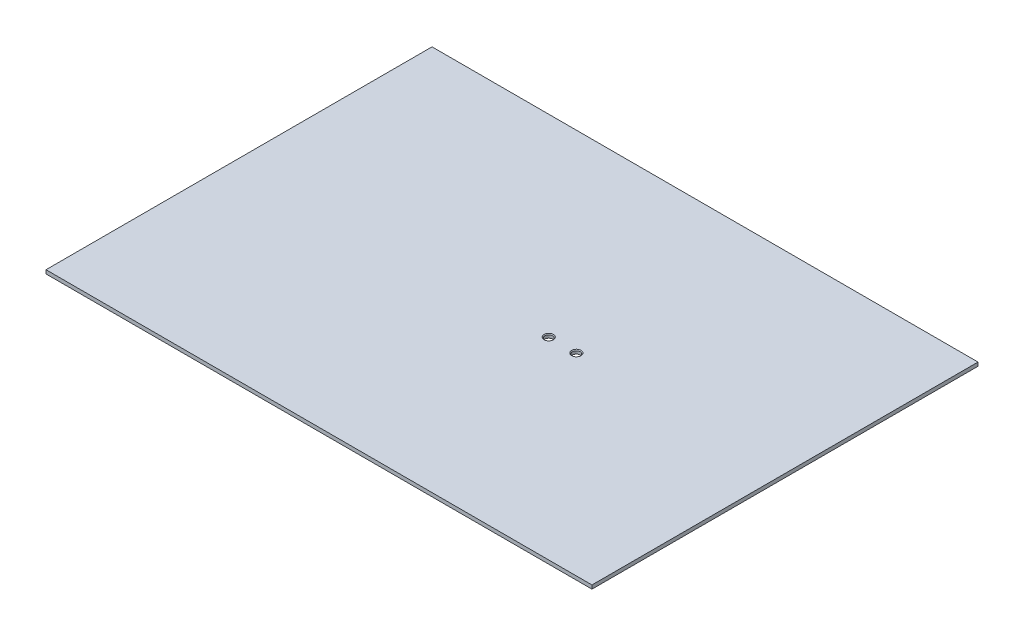
ISO-10303-21;
HEADER;
FILE_DESCRIPTION(('STEP AP214'),'2;1');
FILE_NAME('part.step','',(''),(''),'','','');
FILE_SCHEMA(('AUTOMOTIVE_DESIGN { 1 0 10303 214 1 1 1 1 }'));
ENDSEC;
DATA;
#1=APPLICATION_CONTEXT('core data for automotive mechanical design processes');
#2=APPLICATION_PROTOCOL_DEFINITION('international standard','automotive_design',2000,#1);
#3=PRODUCT_CONTEXT('',#1,'mechanical');
#4=PRODUCT('Part','Part','',(#3));
#5=PRODUCT_RELATED_PRODUCT_CATEGORY('part','',(#4));
#6=PRODUCT_DEFINITION_FORMATION('','',#4);
#7=PRODUCT_DEFINITION_CONTEXT('part definition',#1,'design');
#8=PRODUCT_DEFINITION('design','',#6,#7);
#9=PRODUCT_DEFINITION_SHAPE('','',#8);
#10=(LENGTH_UNIT() NAMED_UNIT(*) SI_UNIT(.MILLI.,.METRE.));
#11=(NAMED_UNIT(*) PLANE_ANGLE_UNIT() SI_UNIT($,.RADIAN.));
#12=(NAMED_UNIT(*) SI_UNIT($,.STERADIAN.) SOLID_ANGLE_UNIT());
#13=UNCERTAINTY_MEASURE_WITH_UNIT(LENGTH_MEASURE(1.E-05),#10,'distance_accuracy_value','');
#14=(GEOMETRIC_REPRESENTATION_CONTEXT(3) GLOBAL_UNCERTAINTY_ASSIGNED_CONTEXT((#13)) GLOBAL_UNIT_ASSIGNED_CONTEXT((#10,
#11,#12)) REPRESENTATION_CONTEXT('',''));
#15=CARTESIAN_POINT('',(0.,0.,0.));
#16=DIRECTION('',(0.,0.,1.));
#17=DIRECTION('',(1.,0.,0.));
#18=AXIS2_PLACEMENT_3D('',#15,#16,#17);
#19=CARTESIAN_POINT('',(-148.5,2.,105.));
#20=DIRECTION('',(-1.,0.,0.));
#21=DIRECTION('',(0.,0.,1.));
#22=AXIS2_PLACEMENT_3D('',#19,#20,#21);
#23=PLANE('',#22);
#24=DIRECTION('',(0.,0.,-1.));
#25=VECTOR('',#24,1.);
#26=CARTESIAN_POINT('',(-148.5,0.,105.));
#27=LINE('',#26,#25);
#28=CARTESIAN_POINT('',(-148.5,0.,105.));
#29=VERTEX_POINT('',#28);
#30=CARTESIAN_POINT('',(-148.5,0.,-105.));
#31=VERTEX_POINT('',#30);
#32=EDGE_CURVE('E117',#29,#31,#27,.T.);
#33=ORIENTED_EDGE('',*,*,#32,.F.);
#34=DIRECTION('',(0.,-1.,0.));
#35=VECTOR('',#34,1.);
#36=CARTESIAN_POINT('',(-148.5,2.,105.));
#37=LINE('',#36,#35);
#38=CARTESIAN_POINT('',(-148.5,2.,105.));
#39=VERTEX_POINT('',#38);
#40=EDGE_CURVE('E11',#39,#29,#37,.T.);
#41=ORIENTED_EDGE('',*,*,#40,.F.);
#42=DIRECTION('',(0.,0.,-1.));
#43=VECTOR('',#42,1.);
#44=CARTESIAN_POINT('',(-148.5,2.,105.));
#45=LINE('',#44,#43);
#46=CARTESIAN_POINT('',(-148.5,2.,-105.));
#47=VERTEX_POINT('',#46);
#48=EDGE_CURVE('E111',#39,#47,#45,.T.);
#49=ORIENTED_EDGE('',*,*,#48,.T.);
#50=DIRECTION('',(0.,-1.,0.));
#51=VECTOR('',#50,1.);
#52=CARTESIAN_POINT('',(-148.5,2.,-105.));
#53=LINE('',#52,#51);
#54=EDGE_CURVE('E54',#47,#31,#53,.T.);
#55=ORIENTED_EDGE('',*,*,#54,.T.);
#56=EDGE_LOOP('',(#33,#41,#49,#55));
#57=FACE_BOUND('',#56,.T.);
#58=ADVANCED_FACE('F51',(#57),#23,.T.);
#59=CARTESIAN_POINT('',(-148.5,2.,105.));
#60=DIRECTION('',(0.,0.,-1.));
#61=DIRECTION('',(-1.,0.,0.));
#62=AXIS2_PLACEMENT_3D('',#59,#60,#61);
#63=PLANE('',#62);
#64=DIRECTION('',(1.,0.,0.));
#65=VECTOR('',#64,1.);
#66=CARTESIAN_POINT('',(-148.5,0.,105.));
#67=LINE('',#66,#65);
#68=CARTESIAN_POINT('',(148.5,0.,105.));
#69=VERTEX_POINT('',#68);
#70=EDGE_CURVE('E84',#29,#69,#67,.T.);
#71=ORIENTED_EDGE('',*,*,#70,.T.);
#72=DIRECTION('',(0.,-1.,0.));
#73=VECTOR('',#72,1.);
#74=CARTESIAN_POINT('',(148.5,2.,105.));
#75=LINE('',#74,#73);
#76=CARTESIAN_POINT('',(148.5,2.,105.));
#77=VERTEX_POINT('',#76);
#78=EDGE_CURVE('E60',#77,#69,#75,.T.);
#79=ORIENTED_EDGE('',*,*,#78,.F.);
#80=DIRECTION('',(1.,0.,0.));
#81=VECTOR('',#80,1.);
#82=CARTESIAN_POINT('',(-148.5,2.,105.));
#83=LINE('',#82,#81);
#84=EDGE_CURVE('E101',#39,#77,#83,.T.);
#85=ORIENTED_EDGE('',*,*,#84,.F.);
#86=ORIENTED_EDGE('',*,*,#40,.T.);
#87=EDGE_LOOP('',(#71,#79,#85,#86));
#88=FACE_BOUND('',#87,.T.);
#89=ADVANCED_FACE('F128',(#88),#63,.F.);
#90=CARTESIAN_POINT('',(148.5,2.,105.));
#91=DIRECTION('',(-1.,0.,0.));
#92=DIRECTION('',(0.,0.,1.));
#93=AXIS2_PLACEMENT_3D('',#90,#91,#92);
#94=PLANE('',#93);
#95=DIRECTION('',(0.,0.,-1.));
#96=VECTOR('',#95,1.);
#97=CARTESIAN_POINT('',(148.5,0.,105.));
#98=LINE('',#97,#96);
#99=CARTESIAN_POINT('',(148.5,0.,-105.));
#100=VERTEX_POINT('',#99);
#101=EDGE_CURVE('E108',#69,#100,#98,.T.);
#102=ORIENTED_EDGE('',*,*,#101,.T.);
#103=DIRECTION('',(0.,-1.,0.));
#104=VECTOR('',#103,1.);
#105=CARTESIAN_POINT('',(148.5,2.,-105.));
#106=LINE('',#105,#104);
#107=CARTESIAN_POINT('',(148.5,2.,-105.));
#108=VERTEX_POINT('',#107);
#109=EDGE_CURVE('E105',#108,#100,#106,.T.);
#110=ORIENTED_EDGE('',*,*,#109,.F.);
#111=DIRECTION('',(0.,0.,-1.));
#112=VECTOR('',#111,1.);
#113=CARTESIAN_POINT('',(148.5,2.,105.));
#114=LINE('',#113,#112);
#115=EDGE_CURVE('E96',#77,#108,#114,.T.);
#116=ORIENTED_EDGE('',*,*,#115,.F.);
#117=ORIENTED_EDGE('',*,*,#78,.T.);
#118=EDGE_LOOP('',(#102,#110,#116,#117));
#119=FACE_BOUND('',#118,.T.);
#120=ADVANCED_FACE('F106',(#119),#94,.F.);
#121=CARTESIAN_POINT('',(-148.5,2.,-105.));
#122=DIRECTION('',(0.,0.,-1.));
#123=DIRECTION('',(-1.,0.,0.));
#124=AXIS2_PLACEMENT_3D('',#121,#122,#123);
#125=PLANE('',#124);
#126=DIRECTION('',(1.,0.,0.));
#127=VECTOR('',#126,1.);
#128=CARTESIAN_POINT('',(-148.5,0.,-105.));
#129=LINE('',#128,#127);
#130=EDGE_CURVE('E120',#31,#100,#129,.T.);
#131=ORIENTED_EDGE('',*,*,#130,.F.);
#132=ORIENTED_EDGE('',*,*,#54,.F.);
#133=DIRECTION('',(1.,0.,0.));
#134=VECTOR('',#133,1.);
#135=CARTESIAN_POINT('',(-148.5,2.,-105.));
#136=LINE('',#135,#134);
#137=EDGE_CURVE('E100',#47,#108,#136,.T.);
#138=ORIENTED_EDGE('',*,*,#137,.T.);
#139=ORIENTED_EDGE('',*,*,#109,.T.);
#140=EDGE_LOOP('',(#131,#132,#138,#139));
#141=FACE_BOUND('',#140,.T.);
#142=ADVANCED_FACE('F110',(#141),#125,.T.);
#143=CARTESIAN_POINT('',(0.,2.,0.));
#144=DIRECTION('',(0.,-1.,0.));
#145=DIRECTION('',(0.,0.,-1.));
#146=AXIS2_PLACEMENT_3D('',#143,#144,#145);
#147=PLANE('',#146);
#148=CARTESIAN_POINT('',(35.,2.,0.));
#149=DIRECTION('',(0.,1.,0.));
#150=DIRECTION('',(0.,0.,1.));
#151=AXIS2_PLACEMENT_3D('',#148,#149,#150);
#152=CIRCLE('',#151,2.525);
#153=CARTESIAN_POINT('',(35.,2.,2.525));
#154=VERTEX_POINT('',#153);
#155=EDGE_CURVE('E174',#154,#154,#152,.T.);
#156=ORIENTED_EDGE('',*,*,#155,.F.);
#157=EDGE_LOOP('',(#156));
#158=FACE_BOUND('',#157,.T.);
#159=CARTESIAN_POINT('',(20.,2.,0.));
#160=DIRECTION('',(0.,1.,0.));
#161=DIRECTION('',(0.,0.,1.));
#162=AXIS2_PLACEMENT_3D('',#159,#160,#161);
#163=CIRCLE('',#162,2.525);
#164=CARTESIAN_POINT('',(20.,2.,2.525));
#165=VERTEX_POINT('',#164);
#166=EDGE_CURVE('E181',#165,#165,#163,.T.);
#167=ORIENTED_EDGE('',*,*,#166,.F.);
#168=EDGE_LOOP('',(#167));
#169=FACE_BOUND('',#168,.T.);
#170=ORIENTED_EDGE('',*,*,#48,.F.);
#171=ORIENTED_EDGE('',*,*,#84,.T.);
#172=ORIENTED_EDGE('',*,*,#115,.T.);
#173=ORIENTED_EDGE('',*,*,#137,.F.);
#174=EDGE_LOOP('',(#170,#171,#172,#173));
#175=FACE_BOUND('',#174,.T.);
#176=ADVANCED_FACE('F99',(#158,#169,#175),#147,.F.);
#177=CARTESIAN_POINT('',(0.,0.,0.));
#178=DIRECTION('',(0.,-1.,0.));
#179=DIRECTION('',(0.,0.,-1.));
#180=AXIS2_PLACEMENT_3D('',#177,#178,#179);
#181=PLANE('',#180);
#182=CARTESIAN_POINT('',(35.,0.,0.));
#183=DIRECTION('',(0.,1.,0.));
#184=DIRECTION('',(0.,0.,1.));
#185=AXIS2_PLACEMENT_3D('',#182,#183,#184);
#186=CIRCLE('',#185,2.1);
#187=CARTESIAN_POINT('',(35.,0.,2.1));
#188=VERTEX_POINT('',#187);
#189=EDGE_CURVE('E176',#188,#188,#186,.T.);
#190=ORIENTED_EDGE('',*,*,#189,.T.);
#191=EDGE_LOOP('',(#190));
#192=FACE_BOUND('',#191,.T.);
#193=CARTESIAN_POINT('',(20.,0.,0.));
#194=DIRECTION('',(0.,1.,0.));
#195=DIRECTION('',(0.,0.,1.));
#196=AXIS2_PLACEMENT_3D('',#193,#194,#195);
#197=CIRCLE('',#196,2.1);
#198=CARTESIAN_POINT('',(20.,0.,2.1));
#199=VERTEX_POINT('',#198);
#200=EDGE_CURVE('E121',#199,#199,#197,.T.);
#201=ORIENTED_EDGE('',*,*,#200,.T.);
#202=EDGE_LOOP('',(#201));
#203=FACE_BOUND('',#202,.T.);
#204=ORIENTED_EDGE('',*,*,#32,.T.);
#205=ORIENTED_EDGE('',*,*,#130,.T.);
#206=ORIENTED_EDGE('',*,*,#101,.F.);
#207=ORIENTED_EDGE('',*,*,#70,.F.);
#208=EDGE_LOOP('',(#204,#205,#206,#207));
#209=FACE_BOUND('',#208,.T.);
#210=ADVANCED_FACE('F126',(#192,#203,#209),#181,.T.);
#211=CARTESIAN_POINT('',(20.,2.,0.));
#212=DIRECTION('',(0.,1.,0.));
#213=DIRECTION('',(0.,0.,1.));
#214=AXIS2_PLACEMENT_3D('',#211,#212,#213);
#215=CYLINDRICAL_SURFACE('',#214,2.09999999999999);
#216=ORIENTED_EDGE('',*,*,#200,.F.);
#217=EDGE_LOOP('',(#216));
#218=FACE_BOUND('',#217,.T.);
#219=CARTESIAN_POINT('',(20.,1.57499999999999,0.));
#220=DIRECTION('',(0.,1.,0.));
#221=DIRECTION('',(0.,0.,1.));
#222=AXIS2_PLACEMENT_3D('',#219,#220,#221);
#223=CIRCLE('',#222,2.09999999999999);
#224=CARTESIAN_POINT('',(20.,1.57499999999999,2.09999999999999));
#225=VERTEX_POINT('',#224);
#226=EDGE_CURVE('E184',#225,#225,#223,.T.);
#227=ORIENTED_EDGE('',*,*,#226,.T.);
#228=EDGE_LOOP('',(#227));
#229=FACE_BOUND('',#228,.T.);
#230=ADVANCED_FACE('F147',(#218,#229),#215,.F.);
#231=CARTESIAN_POINT('',(20.,2.,0.));
#232=DIRECTION('',(0.,1.,0.));
#233=DIRECTION('',(0.,0.,1.));
#234=AXIS2_PLACEMENT_3D('',#231,#232,#233);
#235=CONICAL_SURFACE('',#234,2.525,0.78539816339745);
#236=ORIENTED_EDGE('',*,*,#226,.F.);
#237=EDGE_LOOP('',(#236));
#238=FACE_BOUND('',#237,.T.);
#239=ORIENTED_EDGE('',*,*,#166,.T.);
#240=EDGE_LOOP('',(#239));
#241=FACE_BOUND('',#240,.T.);
#242=ADVANCED_FACE('F154',(#238,#241),#235,.F.);
#243=CARTESIAN_POINT('',(35.,2.,0.));
#244=DIRECTION('',(0.,1.,0.));
#245=DIRECTION('',(0.,0.,1.));
#246=AXIS2_PLACEMENT_3D('',#243,#244,#245);
#247=CYLINDRICAL_SURFACE('',#246,2.09999999999999);
#248=ORIENTED_EDGE('',*,*,#189,.F.);
#249=EDGE_LOOP('',(#248));
#250=FACE_BOUND('',#249,.T.);
#251=CARTESIAN_POINT('',(35.,1.57499999999999,0.));
#252=DIRECTION('',(0.,1.,0.));
#253=DIRECTION('',(0.,0.,1.));
#254=AXIS2_PLACEMENT_3D('',#251,#252,#253);
#255=CIRCLE('',#254,2.09999999999998);
#256=CARTESIAN_POINT('',(35.,1.57499999999999,2.09999999999998));
#257=VERTEX_POINT('',#256);
#258=EDGE_CURVE('E172',#257,#257,#255,.T.);
#259=ORIENTED_EDGE('',*,*,#258,.T.);
#260=EDGE_LOOP('',(#259));
#261=FACE_BOUND('',#260,.T.);
#262=ADVANCED_FACE('F158',(#250,#261),#247,.F.);
#263=CARTESIAN_POINT('',(35.,2.,0.));
#264=DIRECTION('',(0.,1.,0.));
#265=DIRECTION('',(0.,0.,1.));
#266=AXIS2_PLACEMENT_3D('',#263,#264,#265);
#267=CONICAL_SURFACE('',#266,2.525,0.785398163397454);
#268=ORIENTED_EDGE('',*,*,#258,.F.);
#269=EDGE_LOOP('',(#268));
#270=FACE_BOUND('',#269,.T.);
#271=ORIENTED_EDGE('',*,*,#155,.T.);
#272=EDGE_LOOP('',(#271));
#273=FACE_BOUND('',#272,.T.);
#274=ADVANCED_FACE('F162',(#270,#273),#267,.F.);
#275=CLOSED_SHELL('',(#58,#89,#120,#142,#176,#210,#230,#242,#262,#274));
#276=MANIFOLD_SOLID_BREP('B2',#275);
#277=ADVANCED_BREP_SHAPE_REPRESENTATION('',(#18,#276),#14);
#278=SHAPE_DEFINITION_REPRESENTATION(#9,#277);
ENDSEC;
END-ISO-10303-21;
